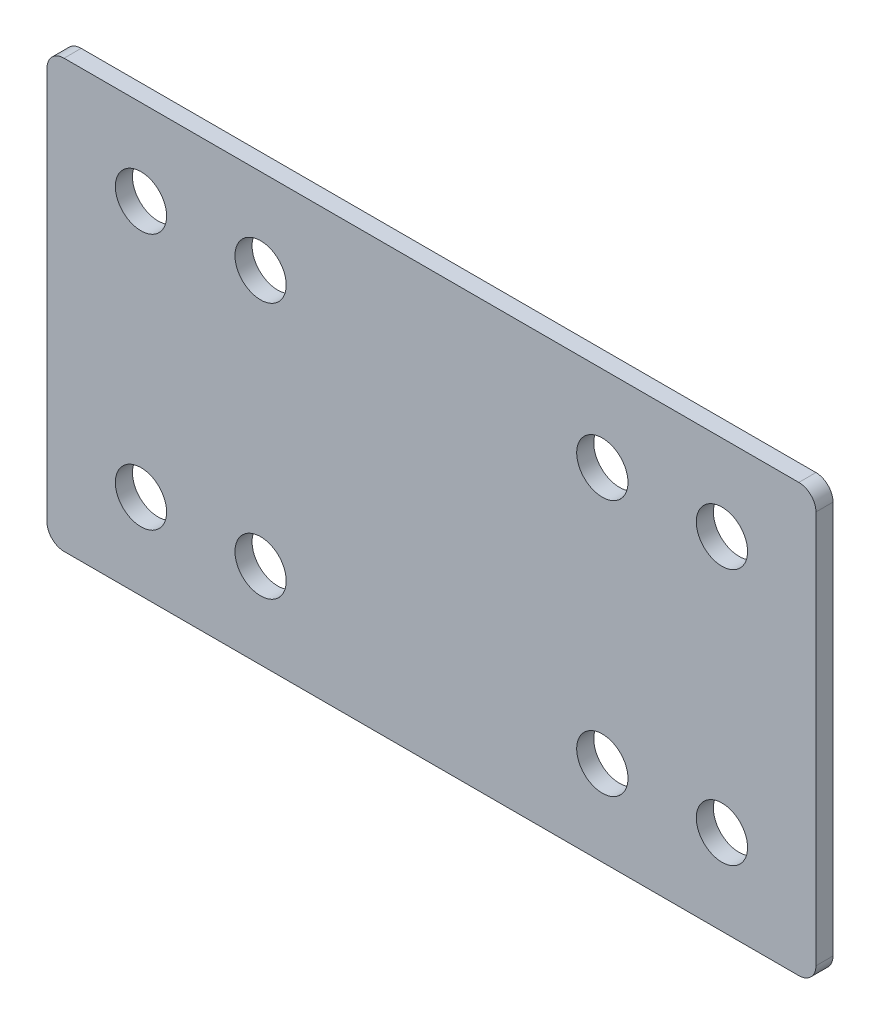
ISO-10303-21;
HEADER;
FILE_DESCRIPTION(('STEP AP214'),'2;1');
FILE_NAME('part.step','',(''),(''),'','','');
FILE_SCHEMA(('AUTOMOTIVE_DESIGN { 1 0 10303 214 1 1 1 1 }'));
ENDSEC;
DATA;
#1=APPLICATION_CONTEXT('core data for automotive mechanical design processes');
#2=APPLICATION_PROTOCOL_DEFINITION('international standard','automotive_design',2000,#1);
#3=PRODUCT_CONTEXT('',#1,'mechanical');
#4=PRODUCT('Part','Part','',(#3));
#5=PRODUCT_RELATED_PRODUCT_CATEGORY('part','',(#4));
#6=PRODUCT_DEFINITION_FORMATION('','',#4);
#7=PRODUCT_DEFINITION_CONTEXT('part definition',#1,'design');
#8=PRODUCT_DEFINITION('design','',#6,#7);
#9=PRODUCT_DEFINITION_SHAPE('','',#8);
#10=(LENGTH_UNIT() NAMED_UNIT(*) SI_UNIT(.MILLI.,.METRE.));
#11=(NAMED_UNIT(*) PLANE_ANGLE_UNIT() SI_UNIT($,.RADIAN.));
#12=(NAMED_UNIT(*) SI_UNIT($,.STERADIAN.) SOLID_ANGLE_UNIT());
#13=UNCERTAINTY_MEASURE_WITH_UNIT(LENGTH_MEASURE(1.E-05),#10,'distance_accuracy_value','');
#14=(GEOMETRIC_REPRESENTATION_CONTEXT(3) GLOBAL_UNCERTAINTY_ASSIGNED_CONTEXT((#13)) GLOBAL_UNIT_ASSIGNED_CONTEXT((#10,
#11,#12)) REPRESENTATION_CONTEXT('',''));
#15=CARTESIAN_POINT('',(0.,0.,0.));
#16=DIRECTION('',(0.,0.,1.));
#17=DIRECTION('',(1.,0.,0.));
#18=AXIS2_PLACEMENT_3D('',#15,#16,#17);
#19=CARTESIAN_POINT('',(22.5,-12.5,1.));
#20=DIRECTION('',(-1.,0.,0.));
#21=DIRECTION('',(0.,0.,1.));
#22=AXIS2_PLACEMENT_3D('',#19,#20,#21);
#23=PLANE('',#22);
#24=DIRECTION('',(0.,1.,0.));
#25=VECTOR('',#24,1.);
#26=CARTESIAN_POINT('',(22.5,-12.5,1.));
#27=LINE('',#26,#25);
#28=CARTESIAN_POINT('',(22.5,-11.5,1.));
#29=VERTEX_POINT('',#28);
#30=CARTESIAN_POINT('',(22.5,11.5,1.));
#31=VERTEX_POINT('',#30);
#32=EDGE_CURVE('E126',#29,#31,#27,.T.);
#33=ORIENTED_EDGE('',*,*,#32,.F.);
#34=DIRECTION('',(0.,0.,-1.));
#35=VECTOR('',#34,1.);
#36=CARTESIAN_POINT('',(22.5,-11.5,1.));
#37=LINE('',#36,#35);
#38=CARTESIAN_POINT('',(22.5,-11.5,0.));
#39=VERTEX_POINT('',#38);
#40=EDGE_CURVE('E11',#29,#39,#37,.T.);
#41=ORIENTED_EDGE('',*,*,#40,.T.);
#42=DIRECTION('',(0.,1.,0.));
#43=VECTOR('',#42,1.);
#44=CARTESIAN_POINT('',(22.5,-12.5,0.));
#45=LINE('',#44,#43);
#46=CARTESIAN_POINT('',(22.5,11.5,0.));
#47=VERTEX_POINT('',#46);
#48=EDGE_CURVE('E157',#39,#47,#45,.T.);
#49=ORIENTED_EDGE('',*,*,#48,.T.);
#50=DIRECTION('',(0.,0.,-1.));
#51=VECTOR('',#50,1.);
#52=CARTESIAN_POINT('',(22.5,11.5,1.));
#53=LINE('',#52,#51);
#54=EDGE_CURVE('E40',#47,#31,#53,.F.);
#55=ORIENTED_EDGE('',*,*,#54,.T.);
#56=EDGE_LOOP('',(#33,#41,#49,#55));
#57=FACE_BOUND('',#56,.T.);
#58=ADVANCED_FACE('F32',(#57),#23,.F.);
#59=CARTESIAN_POINT('',(-22.5,12.5,1.));
#60=DIRECTION('',(0.,-1.,0.));
#61=DIRECTION('',(0.,0.,-1.));
#62=AXIS2_PLACEMENT_3D('',#59,#60,#61);
#63=PLANE('',#62);
#64=DIRECTION('',(-1.,0.,0.));
#65=VECTOR('',#64,1.);
#66=CARTESIAN_POINT('',(-22.5,12.5,0.));
#67=LINE('',#66,#65);
#68=CARTESIAN_POINT('',(21.5,12.5,0.));
#69=VERTEX_POINT('',#68);
#70=CARTESIAN_POINT('',(-21.5,12.5,0.));
#71=VERTEX_POINT('',#70);
#72=EDGE_CURVE('E131',#69,#71,#67,.T.);
#73=ORIENTED_EDGE('',*,*,#72,.T.);
#74=DIRECTION('',(0.,0.,-1.));
#75=VECTOR('',#74,1.);
#76=CARTESIAN_POINT('',(-21.5,12.5,1.));
#77=LINE('',#76,#75);
#78=CARTESIAN_POINT('',(-21.5,12.5,1.));
#79=VERTEX_POINT('',#78);
#80=EDGE_CURVE('E47',#71,#79,#77,.F.);
#81=ORIENTED_EDGE('',*,*,#80,.T.);
#82=DIRECTION('',(-1.,0.,0.));
#83=VECTOR('',#82,1.);
#84=CARTESIAN_POINT('',(-22.5,12.5,1.));
#85=LINE('',#84,#83);
#86=CARTESIAN_POINT('',(21.5,12.5,1.));
#87=VERTEX_POINT('',#86);
#88=EDGE_CURVE('E129',#87,#79,#85,.T.);
#89=ORIENTED_EDGE('',*,*,#88,.F.);
#90=DIRECTION('',(0.,0.,-1.));
#91=VECTOR('',#90,1.);
#92=CARTESIAN_POINT('',(21.5,12.5,1.));
#93=LINE('',#92,#91);
#94=EDGE_CURVE('E149',#87,#69,#93,.T.);
#95=ORIENTED_EDGE('',*,*,#94,.T.);
#96=EDGE_LOOP('',(#73,#81,#89,#95));
#97=FACE_BOUND('',#96,.T.);
#98=ADVANCED_FACE('F164',(#97),#63,.F.);
#99=CARTESIAN_POINT('',(-22.5,-12.5,1.));
#100=DIRECTION('',(1.,0.,0.));
#101=DIRECTION('',(0.,0.,-1.));
#102=AXIS2_PLACEMENT_3D('',#99,#100,#101);
#103=PLANE('',#102);
#104=DIRECTION('',(0.,-1.,0.));
#105=VECTOR('',#104,1.);
#106=CARTESIAN_POINT('',(-22.5,-12.5,0.));
#107=LINE('',#106,#105);
#108=CARTESIAN_POINT('',(-22.5,11.5,0.));
#109=VERTEX_POINT('',#108);
#110=CARTESIAN_POINT('',(-22.5,-11.5,0.));
#111=VERTEX_POINT('',#110);
#112=EDGE_CURVE('E127',#109,#111,#107,.T.);
#113=ORIENTED_EDGE('',*,*,#112,.T.);
#114=DIRECTION('',(0.,0.,-1.));
#115=VECTOR('',#114,1.);
#116=CARTESIAN_POINT('',(-22.5,-11.5,1.));
#117=LINE('',#116,#115);
#118=CARTESIAN_POINT('',(-22.5,-11.5,1.));
#119=VERTEX_POINT('',#118);
#120=EDGE_CURVE('E104',#111,#119,#117,.F.);
#121=ORIENTED_EDGE('',*,*,#120,.T.);
#122=DIRECTION('',(0.,-1.,0.));
#123=VECTOR('',#122,1.);
#124=CARTESIAN_POINT('',(-22.5,-12.5,1.));
#125=LINE('',#124,#123);
#126=CARTESIAN_POINT('',(-22.5,11.5,1.));
#127=VERTEX_POINT('',#126);
#128=EDGE_CURVE('E169',#127,#119,#125,.T.);
#129=ORIENTED_EDGE('',*,*,#128,.F.);
#130=DIRECTION('',(0.,0.,-1.));
#131=VECTOR('',#130,1.);
#132=CARTESIAN_POINT('',(-22.5,11.5,1.));
#133=LINE('',#132,#131);
#134=EDGE_CURVE('E109',#127,#109,#133,.T.);
#135=ORIENTED_EDGE('',*,*,#134,.T.);
#136=EDGE_LOOP('',(#113,#121,#129,#135));
#137=FACE_BOUND('',#136,.T.);
#138=ADVANCED_FACE('F265',(#137),#103,.F.);
#139=CARTESIAN_POINT('',(-22.5,-12.5,1.));
#140=DIRECTION('',(0.,1.,0.));
#141=DIRECTION('',(0.,0.,1.));
#142=AXIS2_PLACEMENT_3D('',#139,#140,#141);
#143=PLANE('',#142);
#144=DIRECTION('',(1.,0.,0.));
#145=VECTOR('',#144,1.);
#146=CARTESIAN_POINT('',(-22.5,-12.5,1.));
#147=LINE('',#146,#145);
#148=CARTESIAN_POINT('',(-21.5,-12.5,1.));
#149=VERTEX_POINT('',#148);
#150=CARTESIAN_POINT('',(21.5,-12.5,1.));
#151=VERTEX_POINT('',#150);
#152=EDGE_CURVE('E119',#149,#151,#147,.T.);
#153=ORIENTED_EDGE('',*,*,#152,.F.);
#154=DIRECTION('',(0.,0.,-1.));
#155=VECTOR('',#154,1.);
#156=CARTESIAN_POINT('',(-21.5,-12.5,1.));
#157=LINE('',#156,#155);
#158=CARTESIAN_POINT('',(-21.5,-12.5,0.));
#159=VERTEX_POINT('',#158);
#160=EDGE_CURVE('E103',#149,#159,#157,.T.);
#161=ORIENTED_EDGE('',*,*,#160,.T.);
#162=DIRECTION('',(1.,0.,0.));
#163=VECTOR('',#162,1.);
#164=CARTESIAN_POINT('',(-22.5,-12.5,0.));
#165=LINE('',#164,#163);
#166=CARTESIAN_POINT('',(21.5,-12.5,0.));
#167=VERTEX_POINT('',#166);
#168=EDGE_CURVE('E116',#159,#167,#165,.T.);
#169=ORIENTED_EDGE('',*,*,#168,.T.);
#170=DIRECTION('',(0.,0.,-1.));
#171=VECTOR('',#170,1.);
#172=CARTESIAN_POINT('',(21.5,-12.5,1.));
#173=LINE('',#172,#171);
#174=EDGE_CURVE('E121',#167,#151,#173,.F.);
#175=ORIENTED_EDGE('',*,*,#174,.T.);
#176=EDGE_LOOP('',(#153,#161,#169,#175));
#177=FACE_BOUND('',#176,.T.);
#178=ADVANCED_FACE('F115',(#177),#143,.F.);
#179=CARTESIAN_POINT('',(0.,0.,1.));
#180=DIRECTION('',(0.,0.,-1.));
#181=DIRECTION('',(-1.,0.,0.));
#182=AXIS2_PLACEMENT_3D('',#179,#180,#181);
#183=PLANE('',#182);
#184=CARTESIAN_POINT('',(10.,-7.5,1.));
#185=DIRECTION('',(0.,0.,1.));
#186=DIRECTION('',(1.,0.,0.));
#187=AXIS2_PLACEMENT_3D('',#184,#185,#186);
#188=CIRCLE('',#187,1.5);
#189=CARTESIAN_POINT('',(11.5,-7.5,1.));
#190=VERTEX_POINT('',#189);
#191=EDGE_CURVE('E214',#190,#190,#188,.T.);
#192=ORIENTED_EDGE('',*,*,#191,.F.);
#193=EDGE_LOOP('',(#192));
#194=FACE_BOUND('',#193,.T.);
#195=CARTESIAN_POINT('',(-10.,-7.5,1.));
#196=DIRECTION('',(0.,0.,1.));
#197=DIRECTION('',(1.,0.,0.));
#198=AXIS2_PLACEMENT_3D('',#195,#196,#197);
#199=CIRCLE('',#198,1.5);
#200=CARTESIAN_POINT('',(-8.5,-7.5,1.));
#201=VERTEX_POINT('',#200);
#202=EDGE_CURVE('E208',#201,#201,#199,.T.);
#203=ORIENTED_EDGE('',*,*,#202,.F.);
#204=EDGE_LOOP('',(#203));
#205=FACE_BOUND('',#204,.T.);
#206=CARTESIAN_POINT('',(-17.,-7.5,1.));
#207=DIRECTION('',(0.,0.,1.));
#208=DIRECTION('',(1.,0.,0.));
#209=AXIS2_PLACEMENT_3D('',#206,#207,#208);
#210=CIRCLE('',#209,1.5);
#211=CARTESIAN_POINT('',(-15.5,-7.5,1.));
#212=VERTEX_POINT('',#211);
#213=EDGE_CURVE('E202',#212,#212,#210,.T.);
#214=ORIENTED_EDGE('',*,*,#213,.F.);
#215=EDGE_LOOP('',(#214));
#216=FACE_BOUND('',#215,.T.);
#217=CARTESIAN_POINT('',(17.,-7.5,1.));
#218=DIRECTION('',(0.,0.,1.));
#219=DIRECTION('',(1.,0.,0.));
#220=AXIS2_PLACEMENT_3D('',#217,#218,#219);
#221=CIRCLE('',#220,1.5);
#222=CARTESIAN_POINT('',(18.5,-7.5,1.));
#223=VERTEX_POINT('',#222);
#224=EDGE_CURVE('E196',#223,#223,#221,.T.);
#225=ORIENTED_EDGE('',*,*,#224,.F.);
#226=EDGE_LOOP('',(#225));
#227=FACE_BOUND('',#226,.T.);
#228=CARTESIAN_POINT('',(17.,7.5,1.));
#229=DIRECTION('',(0.,0.,1.));
#230=DIRECTION('',(1.,0.,0.));
#231=AXIS2_PLACEMENT_3D('',#228,#229,#230);
#232=CIRCLE('',#231,1.5);
#233=CARTESIAN_POINT('',(18.5,7.5,1.));
#234=VERTEX_POINT('',#233);
#235=EDGE_CURVE('E190',#234,#234,#232,.T.);
#236=ORIENTED_EDGE('',*,*,#235,.F.);
#237=EDGE_LOOP('',(#236));
#238=FACE_BOUND('',#237,.T.);
#239=CARTESIAN_POINT('',(10.,7.5,1.));
#240=DIRECTION('',(0.,0.,1.));
#241=DIRECTION('',(1.,0.,0.));
#242=AXIS2_PLACEMENT_3D('',#239,#240,#241);
#243=CIRCLE('',#242,1.5);
#244=CARTESIAN_POINT('',(11.5,7.5,1.));
#245=VERTEX_POINT('',#244);
#246=EDGE_CURVE('E184',#245,#245,#243,.T.);
#247=ORIENTED_EDGE('',*,*,#246,.F.);
#248=EDGE_LOOP('',(#247));
#249=FACE_BOUND('',#248,.T.);
#250=CARTESIAN_POINT('',(-10.,7.5,1.));
#251=DIRECTION('',(0.,0.,1.));
#252=DIRECTION('',(1.,0.,0.));
#253=AXIS2_PLACEMENT_3D('',#250,#251,#252);
#254=CIRCLE('',#253,1.5);
#255=CARTESIAN_POINT('',(-8.5,7.5,1.));
#256=VERTEX_POINT('',#255);
#257=EDGE_CURVE('E178',#256,#256,#254,.T.);
#258=ORIENTED_EDGE('',*,*,#257,.F.);
#259=EDGE_LOOP('',(#258));
#260=FACE_BOUND('',#259,.T.);
#261=CARTESIAN_POINT('',(-17.,7.5,1.));
#262=DIRECTION('',(0.,0.,1.));
#263=DIRECTION('',(1.,0.,0.));
#264=AXIS2_PLACEMENT_3D('',#261,#262,#263);
#265=CIRCLE('',#264,1.5);
#266=CARTESIAN_POINT('',(-15.5,7.5,1.));
#267=VERTEX_POINT('',#266);
#268=EDGE_CURVE('E172',#267,#267,#265,.T.);
#269=ORIENTED_EDGE('',*,*,#268,.F.);
#270=EDGE_LOOP('',(#269));
#271=FACE_BOUND('',#270,.T.);
#272=ORIENTED_EDGE('',*,*,#128,.T.);
#273=CARTESIAN_POINT('',(-21.5,-11.5,1.));
#274=DIRECTION('',(0.,0.,-1.));
#275=DIRECTION('',(-1.,0.,0.));
#276=AXIS2_PLACEMENT_3D('',#273,#274,#275);
#277=CIRCLE('',#276,1.);
#278=EDGE_CURVE('E147',#119,#149,#277,.F.);
#279=ORIENTED_EDGE('',*,*,#278,.T.);
#280=ORIENTED_EDGE('',*,*,#152,.T.);
#281=CARTESIAN_POINT('',(21.5,-11.5,1.));
#282=DIRECTION('',(0.,0.,-1.));
#283=DIRECTION('',(-1.,0.,0.));
#284=AXIS2_PLACEMENT_3D('',#281,#282,#283);
#285=CIRCLE('',#284,1.);
#286=EDGE_CURVE('E143',#151,#29,#285,.F.);
#287=ORIENTED_EDGE('',*,*,#286,.T.);
#288=ORIENTED_EDGE('',*,*,#32,.T.);
#289=CARTESIAN_POINT('',(21.5,11.5,1.));
#290=DIRECTION('',(0.,0.,-1.));
#291=DIRECTION('',(-1.,0.,0.));
#292=AXIS2_PLACEMENT_3D('',#289,#290,#291);
#293=CIRCLE('',#292,1.);
#294=EDGE_CURVE('E54',#31,#87,#293,.F.);
#295=ORIENTED_EDGE('',*,*,#294,.T.);
#296=ORIENTED_EDGE('',*,*,#88,.T.);
#297=CARTESIAN_POINT('',(-21.5,11.5,1.));
#298=DIRECTION('',(0.,0.,-1.));
#299=DIRECTION('',(-1.,0.,0.));
#300=AXIS2_PLACEMENT_3D('',#297,#298,#299);
#301=CIRCLE('',#300,1.);
#302=EDGE_CURVE('E145',#79,#127,#301,.F.);
#303=ORIENTED_EDGE('',*,*,#302,.T.);
#304=EDGE_LOOP('',(#272,#279,#280,#287,#288,#295,#296,#303));
#305=FACE_BOUND('',#304,.T.);
#306=ADVANCED_FACE('F160',(#194,#205,#216,#227,#238,#249,#260,#271,#305),#183,.F.);
#307=CARTESIAN_POINT('',(0.,0.,0.));
#308=DIRECTION('',(0.,0.,-1.));
#309=DIRECTION('',(-1.,0.,0.));
#310=AXIS2_PLACEMENT_3D('',#307,#308,#309);
#311=PLANE('',#310);
#312=CARTESIAN_POINT('',(10.,-7.5,0.));
#313=DIRECTION('',(0.,0.,1.));
#314=DIRECTION('',(1.,0.,0.));
#315=AXIS2_PLACEMENT_3D('',#312,#313,#314);
#316=CIRCLE('',#315,1.5);
#317=CARTESIAN_POINT('',(11.5,-7.5,0.));
#318=VERTEX_POINT('',#317);
#319=EDGE_CURVE('E211',#318,#318,#316,.T.);
#320=ORIENTED_EDGE('',*,*,#319,.T.);
#321=EDGE_LOOP('',(#320));
#322=FACE_BOUND('',#321,.T.);
#323=CARTESIAN_POINT('',(-10.,-7.5,0.));
#324=DIRECTION('',(0.,0.,1.));
#325=DIRECTION('',(1.,0.,0.));
#326=AXIS2_PLACEMENT_3D('',#323,#324,#325);
#327=CIRCLE('',#326,1.5);
#328=CARTESIAN_POINT('',(-8.5,-7.5,0.));
#329=VERTEX_POINT('',#328);
#330=EDGE_CURVE('E205',#329,#329,#327,.T.);
#331=ORIENTED_EDGE('',*,*,#330,.T.);
#332=EDGE_LOOP('',(#331));
#333=FACE_BOUND('',#332,.T.);
#334=CARTESIAN_POINT('',(-17.,-7.5,0.));
#335=DIRECTION('',(0.,0.,1.));
#336=DIRECTION('',(1.,0.,0.));
#337=AXIS2_PLACEMENT_3D('',#334,#335,#336);
#338=CIRCLE('',#337,1.5);
#339=CARTESIAN_POINT('',(-15.5,-7.5,0.));
#340=VERTEX_POINT('',#339);
#341=EDGE_CURVE('E199',#340,#340,#338,.T.);
#342=ORIENTED_EDGE('',*,*,#341,.T.);
#343=EDGE_LOOP('',(#342));
#344=FACE_BOUND('',#343,.T.);
#345=CARTESIAN_POINT('',(17.,-7.5,0.));
#346=DIRECTION('',(0.,0.,1.));
#347=DIRECTION('',(1.,0.,0.));
#348=AXIS2_PLACEMENT_3D('',#345,#346,#347);
#349=CIRCLE('',#348,1.5);
#350=CARTESIAN_POINT('',(18.5,-7.5,0.));
#351=VERTEX_POINT('',#350);
#352=EDGE_CURVE('E193',#351,#351,#349,.T.);
#353=ORIENTED_EDGE('',*,*,#352,.T.);
#354=EDGE_LOOP('',(#353));
#355=FACE_BOUND('',#354,.T.);
#356=CARTESIAN_POINT('',(17.,7.5,0.));
#357=DIRECTION('',(0.,0.,1.));
#358=DIRECTION('',(1.,0.,0.));
#359=AXIS2_PLACEMENT_3D('',#356,#357,#358);
#360=CIRCLE('',#359,1.5);
#361=CARTESIAN_POINT('',(18.5,7.5,0.));
#362=VERTEX_POINT('',#361);
#363=EDGE_CURVE('E187',#362,#362,#360,.T.);
#364=ORIENTED_EDGE('',*,*,#363,.T.);
#365=EDGE_LOOP('',(#364));
#366=FACE_BOUND('',#365,.T.);
#367=CARTESIAN_POINT('',(10.,7.5,0.));
#368=DIRECTION('',(0.,0.,1.));
#369=DIRECTION('',(1.,0.,0.));
#370=AXIS2_PLACEMENT_3D('',#367,#368,#369);
#371=CIRCLE('',#370,1.5);
#372=CARTESIAN_POINT('',(11.5,7.5,0.));
#373=VERTEX_POINT('',#372);
#374=EDGE_CURVE('E181',#373,#373,#371,.T.);
#375=ORIENTED_EDGE('',*,*,#374,.T.);
#376=EDGE_LOOP('',(#375));
#377=FACE_BOUND('',#376,.T.);
#378=CARTESIAN_POINT('',(-10.,7.5,0.));
#379=DIRECTION('',(0.,0.,1.));
#380=DIRECTION('',(1.,0.,0.));
#381=AXIS2_PLACEMENT_3D('',#378,#379,#380);
#382=CIRCLE('',#381,1.5);
#383=CARTESIAN_POINT('',(-8.5,7.5,0.));
#384=VERTEX_POINT('',#383);
#385=EDGE_CURVE('E175',#384,#384,#382,.T.);
#386=ORIENTED_EDGE('',*,*,#385,.T.);
#387=EDGE_LOOP('',(#386));
#388=FACE_BOUND('',#387,.T.);
#389=CARTESIAN_POINT('',(-17.,7.5,0.));
#390=DIRECTION('',(0.,0.,1.));
#391=DIRECTION('',(1.,0.,0.));
#392=AXIS2_PLACEMENT_3D('',#389,#390,#391);
#393=CIRCLE('',#392,1.5);
#394=CARTESIAN_POINT('',(-15.5,7.5,0.));
#395=VERTEX_POINT('',#394);
#396=EDGE_CURVE('E165',#395,#395,#393,.T.);
#397=ORIENTED_EDGE('',*,*,#396,.T.);
#398=EDGE_LOOP('',(#397));
#399=FACE_BOUND('',#398,.T.);
#400=ORIENTED_EDGE('',*,*,#168,.F.);
#401=CARTESIAN_POINT('',(-21.5,-11.5,0.));
#402=DIRECTION('',(0.,0.,-1.));
#403=DIRECTION('',(-1.,0.,0.));
#404=AXIS2_PLACEMENT_3D('',#401,#402,#403);
#405=CIRCLE('',#404,1.);
#406=EDGE_CURVE('E99',#159,#111,#405,.T.);
#407=ORIENTED_EDGE('',*,*,#406,.T.);
#408=ORIENTED_EDGE('',*,*,#112,.F.);
#409=CARTESIAN_POINT('',(-21.5,11.5,0.));
#410=DIRECTION('',(0.,0.,-1.));
#411=DIRECTION('',(-1.,0.,0.));
#412=AXIS2_PLACEMENT_3D('',#409,#410,#411);
#413=CIRCLE('',#412,1.);
#414=EDGE_CURVE('E110',#109,#71,#413,.T.);
#415=ORIENTED_EDGE('',*,*,#414,.T.);
#416=ORIENTED_EDGE('',*,*,#72,.F.);
#417=CARTESIAN_POINT('',(21.5,11.5,0.));
#418=DIRECTION('',(0.,0.,-1.));
#419=DIRECTION('',(-1.,0.,0.));
#420=AXIS2_PLACEMENT_3D('',#417,#418,#419);
#421=CIRCLE('',#420,1.);
#422=EDGE_CURVE('E120',#69,#47,#421,.T.);
#423=ORIENTED_EDGE('',*,*,#422,.T.);
#424=ORIENTED_EDGE('',*,*,#48,.F.);
#425=CARTESIAN_POINT('',(21.5,-11.5,0.));
#426=DIRECTION('',(0.,0.,-1.));
#427=DIRECTION('',(-1.,0.,0.));
#428=AXIS2_PLACEMENT_3D('',#425,#426,#427);
#429=CIRCLE('',#428,1.);
#430=EDGE_CURVE('E125',#39,#167,#429,.T.);
#431=ORIENTED_EDGE('',*,*,#430,.T.);
#432=EDGE_LOOP('',(#400,#407,#408,#415,#416,#423,#424,#431));
#433=FACE_BOUND('',#432,.T.);
#434=ADVANCED_FACE('F123',(#322,#333,#344,#355,#366,#377,#388,#399,#433),#311,.T.);
#435=CARTESIAN_POINT('',(-17.,7.5,0.));
#436=DIRECTION('',(0.,0.,1.));
#437=DIRECTION('',(1.,0.,0.));
#438=AXIS2_PLACEMENT_3D('',#435,#436,#437);
#439=CYLINDRICAL_SURFACE('',#438,1.5);
#440=ORIENTED_EDGE('',*,*,#396,.F.);
#441=EDGE_LOOP('',(#440));
#442=FACE_BOUND('',#441,.T.);
#443=ORIENTED_EDGE('',*,*,#268,.T.);
#444=EDGE_LOOP('',(#443));
#445=FACE_BOUND('',#444,.T.);
#446=ADVANCED_FACE('F246',(#442,#445),#439,.F.);
#447=CARTESIAN_POINT('',(-10.,7.5,0.));
#448=DIRECTION('',(0.,0.,1.));
#449=DIRECTION('',(1.,0.,0.));
#450=AXIS2_PLACEMENT_3D('',#447,#448,#449);
#451=CYLINDRICAL_SURFACE('',#450,1.5);
#452=ORIENTED_EDGE('',*,*,#385,.F.);
#453=EDGE_LOOP('',(#452));
#454=FACE_BOUND('',#453,.T.);
#455=ORIENTED_EDGE('',*,*,#257,.T.);
#456=EDGE_LOOP('',(#455));
#457=FACE_BOUND('',#456,.T.);
#458=ADVANCED_FACE('F248',(#454,#457),#451,.F.);
#459=CARTESIAN_POINT('',(10.,7.5,0.));
#460=DIRECTION('',(0.,0.,1.));
#461=DIRECTION('',(1.,0.,0.));
#462=AXIS2_PLACEMENT_3D('',#459,#460,#461);
#463=CYLINDRICAL_SURFACE('',#462,1.5);
#464=ORIENTED_EDGE('',*,*,#374,.F.);
#465=EDGE_LOOP('',(#464));
#466=FACE_BOUND('',#465,.T.);
#467=ORIENTED_EDGE('',*,*,#246,.T.);
#468=EDGE_LOOP('',(#467));
#469=FACE_BOUND('',#468,.T.);
#470=ADVANCED_FACE('F255',(#466,#469),#463,.F.);
#471=CARTESIAN_POINT('',(17.,7.5,0.));
#472=DIRECTION('',(0.,0.,1.));
#473=DIRECTION('',(1.,0.,0.));
#474=AXIS2_PLACEMENT_3D('',#471,#472,#473);
#475=CYLINDRICAL_SURFACE('',#474,1.5);
#476=ORIENTED_EDGE('',*,*,#363,.F.);
#477=EDGE_LOOP('',(#476));
#478=FACE_BOUND('',#477,.T.);
#479=ORIENTED_EDGE('',*,*,#235,.T.);
#480=EDGE_LOOP('',(#479));
#481=FACE_BOUND('',#480,.T.);
#482=ADVANCED_FACE('F350',(#478,#481),#475,.F.);
#483=CARTESIAN_POINT('',(17.,-7.5,0.));
#484=DIRECTION('',(0.,0.,1.));
#485=DIRECTION('',(1.,0.,0.));
#486=AXIS2_PLACEMENT_3D('',#483,#484,#485);
#487=CYLINDRICAL_SURFACE('',#486,1.5);
#488=ORIENTED_EDGE('',*,*,#352,.F.);
#489=EDGE_LOOP('',(#488));
#490=FACE_BOUND('',#489,.T.);
#491=ORIENTED_EDGE('',*,*,#224,.T.);
#492=EDGE_LOOP('',(#491));
#493=FACE_BOUND('',#492,.T.);
#494=ADVANCED_FACE('F342',(#490,#493),#487,.F.);
#495=CARTESIAN_POINT('',(-17.,-7.5,0.));
#496=DIRECTION('',(0.,0.,1.));
#497=DIRECTION('',(1.,0.,0.));
#498=AXIS2_PLACEMENT_3D('',#495,#496,#497);
#499=CYLINDRICAL_SURFACE('',#498,1.5);
#500=ORIENTED_EDGE('',*,*,#341,.F.);
#501=EDGE_LOOP('',(#500));
#502=FACE_BOUND('',#501,.T.);
#503=ORIENTED_EDGE('',*,*,#213,.T.);
#504=EDGE_LOOP('',(#503));
#505=FACE_BOUND('',#504,.T.);
#506=ADVANCED_FACE('F334',(#502,#505),#499,.F.);
#507=CARTESIAN_POINT('',(-10.,-7.5,0.));
#508=DIRECTION('',(0.,0.,1.));
#509=DIRECTION('',(1.,0.,0.));
#510=AXIS2_PLACEMENT_3D('',#507,#508,#509);
#511=CYLINDRICAL_SURFACE('',#510,1.5);
#512=ORIENTED_EDGE('',*,*,#330,.F.);
#513=EDGE_LOOP('',(#512));
#514=FACE_BOUND('',#513,.T.);
#515=ORIENTED_EDGE('',*,*,#202,.T.);
#516=EDGE_LOOP('',(#515));
#517=FACE_BOUND('',#516,.T.);
#518=ADVANCED_FACE('F225',(#514,#517),#511,.F.);
#519=CARTESIAN_POINT('',(10.,-7.5,0.));
#520=DIRECTION('',(0.,0.,1.));
#521=DIRECTION('',(1.,0.,0.));
#522=AXIS2_PLACEMENT_3D('',#519,#520,#521);
#523=CYLINDRICAL_SURFACE('',#522,1.5);
#524=ORIENTED_EDGE('',*,*,#319,.F.);
#525=EDGE_LOOP('',(#524));
#526=FACE_BOUND('',#525,.T.);
#527=ORIENTED_EDGE('',*,*,#191,.T.);
#528=EDGE_LOOP('',(#527));
#529=FACE_BOUND('',#528,.T.);
#530=ADVANCED_FACE('F222',(#526,#529),#523,.F.);
#531=CARTESIAN_POINT('',(-21.5,-11.5,1.));
#532=DIRECTION('',(0.,0.,-1.));
#533=DIRECTION('',(-1.,0.,0.));
#534=AXIS2_PLACEMENT_3D('',#531,#532,#533);
#535=CYLINDRICAL_SURFACE('',#534,1.);
#536=ORIENTED_EDGE('',*,*,#278,.F.);
#537=ORIENTED_EDGE('',*,*,#120,.F.);
#538=ORIENTED_EDGE('',*,*,#406,.F.);
#539=ORIENTED_EDGE('',*,*,#160,.F.);
#540=EDGE_LOOP('',(#536,#537,#538,#539));
#541=FACE_BOUND('',#540,.T.);
#542=ADVANCED_FACE('F102',(#541),#535,.T.);
#543=CARTESIAN_POINT('',(-21.5,11.5,1.));
#544=DIRECTION('',(0.,0.,-1.));
#545=DIRECTION('',(-1.,0.,0.));
#546=AXIS2_PLACEMENT_3D('',#543,#544,#545);
#547=CYLINDRICAL_SURFACE('',#546,1.);
#548=ORIENTED_EDGE('',*,*,#302,.F.);
#549=ORIENTED_EDGE('',*,*,#80,.F.);
#550=ORIENTED_EDGE('',*,*,#414,.F.);
#551=ORIENTED_EDGE('',*,*,#134,.F.);
#552=EDGE_LOOP('',(#548,#549,#550,#551));
#553=FACE_BOUND('',#552,.T.);
#554=ADVANCED_FACE('F271',(#553),#547,.T.);
#555=CARTESIAN_POINT('',(21.5,-11.5,1.));
#556=DIRECTION('',(0.,0.,-1.));
#557=DIRECTION('',(-1.,0.,0.));
#558=AXIS2_PLACEMENT_3D('',#555,#556,#557);
#559=CYLINDRICAL_SURFACE('',#558,1.);
#560=ORIENTED_EDGE('',*,*,#286,.F.);
#561=ORIENTED_EDGE('',*,*,#174,.F.);
#562=ORIENTED_EDGE('',*,*,#430,.F.);
#563=ORIENTED_EDGE('',*,*,#40,.F.);
#564=EDGE_LOOP('',(#560,#561,#562,#563));
#565=FACE_BOUND('',#564,.T.);
#566=ADVANCED_FACE('F273',(#565),#559,.T.);
#567=CARTESIAN_POINT('',(21.5,11.5,1.));
#568=DIRECTION('',(0.,0.,-1.));
#569=DIRECTION('',(-1.,0.,0.));
#570=AXIS2_PLACEMENT_3D('',#567,#568,#569);
#571=CYLINDRICAL_SURFACE('',#570,1.);
#572=ORIENTED_EDGE('',*,*,#294,.F.);
#573=ORIENTED_EDGE('',*,*,#54,.F.);
#574=ORIENTED_EDGE('',*,*,#422,.F.);
#575=ORIENTED_EDGE('',*,*,#94,.F.);
#576=EDGE_LOOP('',(#572,#573,#574,#575));
#577=FACE_BOUND('',#576,.T.);
#578=ADVANCED_FACE('F34',(#577),#571,.T.);
#579=CLOSED_SHELL('',(#58,#98,#138,#178,#306,#434,#446,#458,#470,#482,#494,#506,#518,#530,#542,
#554,#566,#578));
#580=MANIFOLD_SOLID_BREP('B2',#579);
#581=ADVANCED_BREP_SHAPE_REPRESENTATION('',(#18,#580),#14);
#582=SHAPE_DEFINITION_REPRESENTATION(#9,#581);
ENDSEC;
END-ISO-10303-21;
